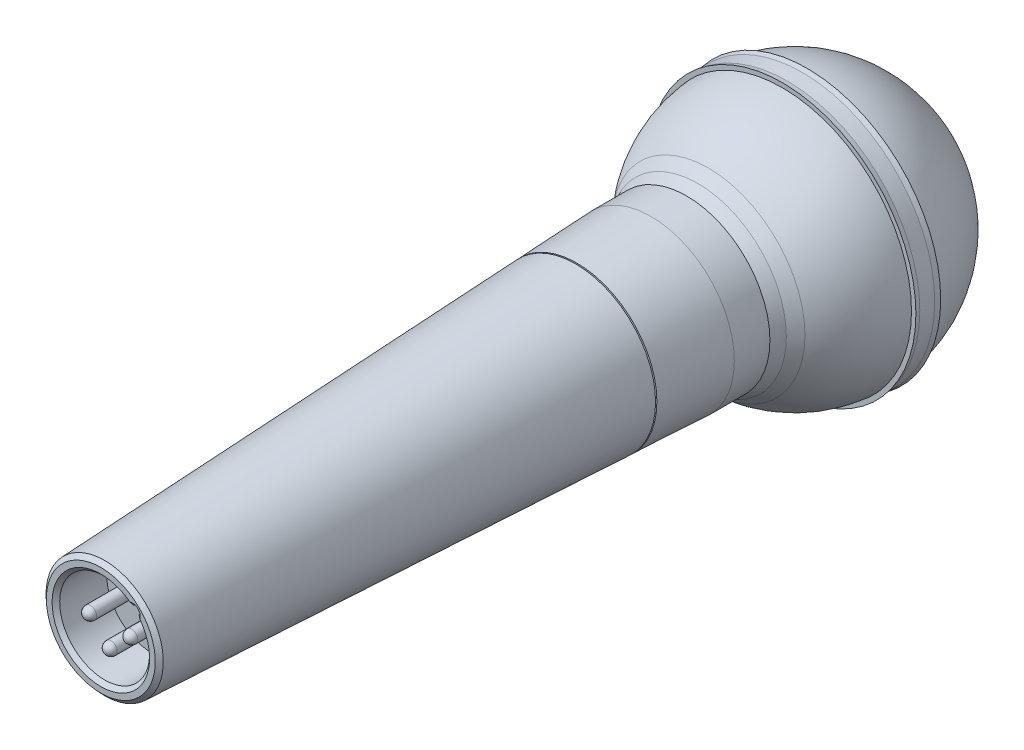
ISO-10303-21;
HEADER;
FILE_DESCRIPTION(('STEP AP214'),'2;1');
FILE_NAME('part.step','',(''),(''),'','','');
FILE_SCHEMA(('AUTOMOTIVE_DESIGN { 1 0 10303 214 1 1 1 1 }'));
ENDSEC;
DATA;
#1=APPLICATION_CONTEXT('core data for automotive mechanical design processes');
#2=APPLICATION_PROTOCOL_DEFINITION('international standard','automotive_design',2000,#1);
#3=PRODUCT_CONTEXT('',#1,'mechanical');
#4=PRODUCT('Part','Part','',(#3));
#5=PRODUCT_RELATED_PRODUCT_CATEGORY('part','',(#4));
#6=PRODUCT_DEFINITION_FORMATION('','',#4);
#7=PRODUCT_DEFINITION_CONTEXT('part definition',#1,'design');
#8=PRODUCT_DEFINITION('design','',#6,#7);
#9=PRODUCT_DEFINITION_SHAPE('','',#8);
#10=(LENGTH_UNIT() NAMED_UNIT(*) SI_UNIT(.MILLI.,.METRE.));
#11=(NAMED_UNIT(*) PLANE_ANGLE_UNIT() SI_UNIT($,.RADIAN.));
#12=(NAMED_UNIT(*) SI_UNIT($,.STERADIAN.) SOLID_ANGLE_UNIT());
#13=UNCERTAINTY_MEASURE_WITH_UNIT(LENGTH_MEASURE(1.E-05),#10,'distance_accuracy_value','');
#14=(GEOMETRIC_REPRESENTATION_CONTEXT(3) GLOBAL_UNCERTAINTY_ASSIGNED_CONTEXT((#13)) GLOBAL_UNIT_ASSIGNED_CONTEXT((#10,
#11,#12)) REPRESENTATION_CONTEXT('',''));
#15=CARTESIAN_POINT('',(0.,0.,0.));
#16=DIRECTION('',(0.,0.,1.));
#17=DIRECTION('',(1.,0.,0.));
#18=AXIS2_PLACEMENT_3D('',#15,#16,#17);
#19=CARTESIAN_POINT('',(0.,-4.0005,134.5));
#20=DIRECTION('',(0.,0.,-1.));
#21=DIRECTION('',(-1.,0.,0.));
#22=AXIS2_PLACEMENT_3D('',#19,#20,#21);
#23=CYLINDRICAL_SURFACE('',#22,1.2285);
#24=CARTESIAN_POINT('',(0.,-4.0005,134.5));
#25=DIRECTION('',(0.,0.,1.));
#26=DIRECTION('',(1.,0.,0.));
#27=AXIS2_PLACEMENT_3D('',#24,#25,#26);
#28=CIRCLE('',#27,1.2285);
#29=CARTESIAN_POINT('',(1.2285,-4.0005,134.5));
#30=VERTEX_POINT('',#29);
#31=EDGE_CURVE('E11',#30,#30,#28,.T.);
#32=ORIENTED_EDGE('',*,*,#31,.F.);
#33=EDGE_LOOP('',(#32));
#34=FACE_BOUND('',#33,.T.);
#35=CARTESIAN_POINT('',(0.,-4.0005,126.5));
#36=DIRECTION('',(0.,0.,1.));
#37=DIRECTION('',(1.,0.,0.));
#38=AXIS2_PLACEMENT_3D('',#35,#36,#37);
#39=CIRCLE('',#38,1.2285);
#40=CARTESIAN_POINT('',(1.2285,-4.0005,126.5));
#41=VERTEX_POINT('',#40);
#42=EDGE_CURVE('E50',#41,#41,#39,.T.);
#43=ORIENTED_EDGE('',*,*,#42,.T.);
#44=EDGE_LOOP('',(#43));
#45=FACE_BOUND('',#44,.T.);
#46=ADVANCED_FACE('F43',(#34,#45),#23,.T.);
#47=CARTESIAN_POINT('',(0.,-4.0005,134.5));
#48=DIRECTION('',(0.,0.,1.));
#49=DIRECTION('',(1.,0.,0.));
#50=AXIS2_PLACEMENT_3D('',#47,#48,#49);
#51=SPHERICAL_SURFACE('',#50,1.2285);
#52=ORIENTED_EDGE('',*,*,#31,.T.);
#53=EDGE_LOOP('',(#52));
#54=FACE_BOUND('',#53,.T.);
#55=ADVANCED_FACE('F45',(#54),#51,.T.);
#56=CARTESIAN_POINT('',(0.,-4.0005,126.5));
#57=DIRECTION('',(0.,0.,1.));
#58=DIRECTION('',(1.,0.,0.));
#59=AXIS2_PLACEMENT_3D('',#56,#57,#58);
#60=PLANE('',#59);
#61=ORIENTED_EDGE('',*,*,#42,.F.);
#62=EDGE_LOOP('',(#61));
#63=FACE_BOUND('',#62,.T.);
#64=ADVANCED_FACE('F57',(#63),#60,.F.);
#65=CLOSED_SHELL('',(#46,#55,#64));
#66=MANIFOLD_SOLID_BREP('B2',#65);
#67=CARTESIAN_POINT('',(4.05003,0.,134.5));
#68=DIRECTION('',(0.,0.,-1.));
#69=DIRECTION('',(-1.,0.,0.));
#70=AXIS2_PLACEMENT_3D('',#67,#68,#69);
#71=CYLINDRICAL_SURFACE('',#70,1.2285);
#72=CARTESIAN_POINT('',(4.05003,0.,134.5));
#73=DIRECTION('',(0.,0.,1.));
#74=DIRECTION('',(1.,0.,0.));
#75=AXIS2_PLACEMENT_3D('',#72,#73,#74);
#76=CIRCLE('',#75,1.2285);
#77=CARTESIAN_POINT('',(5.27853,0.,134.5));
#78=VERTEX_POINT('',#77);
#79=EDGE_CURVE('E42',#78,#78,#76,.T.);
#80=ORIENTED_EDGE('',*,*,#79,.F.);
#81=EDGE_LOOP('',(#80));
#82=FACE_BOUND('',#81,.T.);
#83=CARTESIAN_POINT('',(4.05003,0.,126.5));
#84=DIRECTION('',(0.,0.,1.));
#85=DIRECTION('',(1.,0.,0.));
#86=AXIS2_PLACEMENT_3D('',#83,#84,#85);
#87=CIRCLE('',#86,1.2285);
#88=CARTESIAN_POINT('',(5.27853,0.,126.5));
#89=VERTEX_POINT('',#88);
#90=EDGE_CURVE('E98',#89,#89,#87,.T.);
#91=ORIENTED_EDGE('',*,*,#90,.T.);
#92=EDGE_LOOP('',(#91));
#93=FACE_BOUND('',#92,.T.);
#94=ADVANCED_FACE('F91',(#82,#93),#71,.T.);
#95=CARTESIAN_POINT('',(4.05003,0.,134.5));
#96=DIRECTION('',(0.,0.,1.));
#97=DIRECTION('',(1.,0.,0.));
#98=AXIS2_PLACEMENT_3D('',#95,#96,#97);
#99=SPHERICAL_SURFACE('',#98,1.2285);
#100=ORIENTED_EDGE('',*,*,#79,.T.);
#101=EDGE_LOOP('',(#100));
#102=FACE_BOUND('',#101,.T.);
#103=ADVANCED_FACE('F93',(#102),#99,.T.);
#104=CARTESIAN_POINT('',(4.05003,0.,126.5));
#105=DIRECTION('',(0.,0.,1.));
#106=DIRECTION('',(1.,0.,0.));
#107=AXIS2_PLACEMENT_3D('',#104,#105,#106);
#108=PLANE('',#107);
#109=ORIENTED_EDGE('',*,*,#90,.F.);
#110=EDGE_LOOP('',(#109));
#111=FACE_BOUND('',#110,.T.);
#112=ADVANCED_FACE('F105',(#111),#108,.F.);
#113=CLOSED_SHELL('',(#94,#103,#112));
#114=MANIFOLD_SOLID_BREP('B6',#113);
#115=CARTESIAN_POINT('',(-4.05003,0.,134.5));
#116=DIRECTION('',(0.,0.,-1.));
#117=DIRECTION('',(-1.,0.,0.));
#118=AXIS2_PLACEMENT_3D('',#115,#116,#117);
#119=CYLINDRICAL_SURFACE('',#118,1.2285);
#120=CARTESIAN_POINT('',(-4.05003,0.,134.5));
#121=DIRECTION('',(0.,0.,1.));
#122=DIRECTION('',(1.,0.,0.));
#123=AXIS2_PLACEMENT_3D('',#120,#121,#122);
#124=CIRCLE('',#123,1.2285);
#125=CARTESIAN_POINT('',(-2.82153,0.,134.5));
#126=VERTEX_POINT('',#125);
#127=EDGE_CURVE('E90',#126,#126,#124,.T.);
#128=ORIENTED_EDGE('',*,*,#127,.F.);
#129=EDGE_LOOP('',(#128));
#130=FACE_BOUND('',#129,.T.);
#131=CARTESIAN_POINT('',(-4.05003,0.,126.5));
#132=DIRECTION('',(0.,0.,1.));
#133=DIRECTION('',(1.,0.,0.));
#134=AXIS2_PLACEMENT_3D('',#131,#132,#133);
#135=CIRCLE('',#134,1.2285);
#136=CARTESIAN_POINT('',(-2.82153,0.,126.5));
#137=VERTEX_POINT('',#136);
#138=EDGE_CURVE('E146',#137,#137,#135,.T.);
#139=ORIENTED_EDGE('',*,*,#138,.T.);
#140=EDGE_LOOP('',(#139));
#141=FACE_BOUND('',#140,.T.);
#142=ADVANCED_FACE('F139',(#130,#141),#119,.T.);
#143=CARTESIAN_POINT('',(-4.05003,0.,134.5));
#144=DIRECTION('',(0.,0.,1.));
#145=DIRECTION('',(1.,0.,0.));
#146=AXIS2_PLACEMENT_3D('',#143,#144,#145);
#147=SPHERICAL_SURFACE('',#146,1.2285);
#148=ORIENTED_EDGE('',*,*,#127,.T.);
#149=EDGE_LOOP('',(#148));
#150=FACE_BOUND('',#149,.T.);
#151=ADVANCED_FACE('F141',(#150),#147,.T.);
#152=CARTESIAN_POINT('',(-4.05003,0.,126.5));
#153=DIRECTION('',(0.,0.,1.));
#154=DIRECTION('',(1.,0.,0.));
#155=AXIS2_PLACEMENT_3D('',#152,#153,#154);
#156=PLANE('',#155);
#157=ORIENTED_EDGE('',*,*,#138,.F.);
#158=EDGE_LOOP('',(#157));
#159=FACE_BOUND('',#158,.T.);
#160=ADVANCED_FACE('F153',(#159),#156,.F.);
#161=CLOSED_SHELL('',(#142,#151,#160));
#162=MANIFOLD_SOLID_BREP('B37',#161);
#163=CARTESIAN_POINT('',(0.,0.,0.));
#164=DIRECTION('',(0.,0.,1.));
#165=DIRECTION('',(0.,1.,0.));
#166=AXIS2_PLACEMENT_3D('',#163,#164,#165);
#167=SPHERICAL_SURFACE('',#166,25.5);
#168=CARTESIAN_POINT('',(0.,0.,2.4259649046865));
#169=DIRECTION('',(0.,0.,1.));
#170=DIRECTION('',(1.,0.,0.));
#171=AXIS2_PLACEMENT_3D('',#168,#169,#170);
#172=CIRCLE('',#171,25.3843395478635);
#173=CARTESIAN_POINT('',(0.,25.3843395478635,2.4259649046865));
#174=VERTEX_POINT('',#173);
#175=EDGE_CURVE('E211',#174,#174,#172,.T.);
#176=CARTESIAN_POINT('',(0.,0.,-2.45102114535634));
#177=DIRECTION('',(0.,0.,1.));
#178=DIRECTION('',(1.,0.,0.));
#179=AXIS2_PLACEMENT_3D('',#176,#177,#178);
#180=CIRCLE('',#179,25.381932458838);
#181=CARTESIAN_POINT('',(0.,25.381932458838,-2.45102114535634));
#182=VERTEX_POINT('',#181);
#183=EDGE_CURVE('E138',#182,#182,#180,.T.);
#184=CARTESIAN_POINT('',(0.,25.3843395478635,2.4259649046865));
#185=CARTESIAN_POINT('',(0.,25.3891800339666,2.3753159886136));
#186=CARTESIAN_POINT('',(0.,25.393868927929,2.32465258499832));
#187=CARTESIAN_POINT('',(0.,25.4029433721403,2.22329861873268));
#188=CARTESIAN_POINT('',(0.,25.4073289223892,2.17260805608232));
#189=CARTESIAN_POINT('',(0.,25.4157965197412,2.07120158779621));
#190=CARTESIAN_POINT('',(0.,25.4198785668443,2.02048568216046));
#191=CARTESIAN_POINT('',(0.,25.4277390122595,1.91903034512205));
#192=CARTESIAN_POINT('',(0.,25.4315174105715,1.86829091371938));
#193=CARTESIAN_POINT('',(0.,25.4387704228587,1.76679034313868));
#194=CARTESIAN_POINT('',(0.,25.4422450368338,1.71602920396064));
#195=CARTESIAN_POINT('',(0.,25.4488903559951,1.61448703661726));
#196=CARTESIAN_POINT('',(0.,25.4520610611812,1.56370600845192));
#197=CARTESIAN_POINT('',(0.,25.4580984491455,1.46212588262959));
#198=CARTESIAN_POINT('',(0.,25.4609651319237,1.41132678497261));
#199=CARTESIAN_POINT('',(0.,25.4663943723612,1.30971234031146));
#200=CARTESIAN_POINT('',(0.,25.4689569300206,1.25889699330729));
#201=CARTESIAN_POINT('',(0.,25.4737778284026,1.15725187067807));
#202=CARTESIAN_POINT('',(0.,25.4760361691254,1.10642209505302));
#203=CARTESIAN_POINT('',(0.,25.4802485527174,1.00474993642543));
#204=CARTESIAN_POINT('',(0.,25.4822025955867,0.95390755342289));
#205=CARTESIAN_POINT('',(0.,25.4858063134581,0.8522120017354));
#206=CARTESIAN_POINT('',(0.,25.4874559884602,0.801358833050451));
#207=CARTESIAN_POINT('',(0.,25.4904509114888,0.699643532079691));
#208=CARTESIAN_POINT('',(0.,25.4917961595154,0.648781399793879));
#209=CARTESIAN_POINT('',(0.,25.4941821803925,0.547049994024107));
#210=CARTESIAN_POINT('',(0.,25.495222953243,0.496180720540146));
#211=CARTESIAN_POINT('',(0.,25.4969999864768,0.394436855032657));
#212=CARTESIAN_POINT('',(0.,25.49773624686,0.34356226300913));
#213=CARTESIAN_POINT('',(0.,25.498904228779,0.241809583271656));
#214=CARTESIAN_POINT('',(0.,25.4993359503146,0.19093149555771));
#215=CARTESIAN_POINT('',(0.,25.4998948390696,0.0891736474137984));
#216=CARTESIAN_POINT('',(0.,25.500022006289,0.0382938869838331));
#217=CARTESIAN_POINT('',(0.,25.499971781855,-0.0634654835577837));
#218=CARTESIAN_POINT('',(0.,25.4997943902016,-0.114345093669435));
#219=CARTESIAN_POINT('',(0.,25.4991350543781,-0.216102340545477));
#220=CARTESIAN_POINT('',(0.,25.498653110208,-0.266979977309867));
#221=CARTESIAN_POINT('',(0.,25.4973846866192,-0.368731454533145));
#222=CARTESIAN_POINT('',(0.,25.4965982072005,-0.419605294992032));
#223=CARTESIAN_POINT('',(0.,25.4947207412943,-0.521347356782085));
#224=CARTESIAN_POINT('',(0.,25.4936297548068,-0.57221557811325));
#225=CARTESIAN_POINT('',(0.,25.4911433138532,-0.673944579026974));
#226=CARTESIAN_POINT('',(0.,25.4897478593872,-0.724805358609533));
#227=CARTESIAN_POINT('',(0.,25.4866525324761,-0.826517653671799));
#228=CARTESIAN_POINT('',(0.,25.4849526600311,-0.877369169151507));
#229=CARTESIAN_POINT('',(0.,25.4812485580688,-0.97906111398576));
#230=CARTESIAN_POINT('',(0.,25.4792443285516,-1.02990154334031));
#231=CARTESIAN_POINT('',(0.,25.474931584257,-1.13156949429915));
#232=CARTESIAN_POINT('',(0.,25.4726230694797,-1.18239701590345));
#233=CARTESIAN_POINT('',(0.,25.4677018373794,-1.28403733019917));
#234=CARTESIAN_POINT('',(0.,25.4650891200564,-1.3348501228906));
#235=CARTESIAN_POINT('',(0.,25.4595595764798,-1.43645915872579));
#236=CARTESIAN_POINT('',(0.,25.4566427502263,-1.48725540186956));
#237=CARTESIAN_POINT('',(0.,25.4505050932962,-1.58882951856727));
#238=CARTESIAN_POINT('',(0.,25.4472842626196,-1.63960739212121));
#239=CARTESIAN_POINT('',(0.,25.4405387122583,-1.74114295025662));
#240=CARTESIAN_POINT('',(0.,25.4370139925736,-1.79190063483809));
#241=CARTESIAN_POINT('',(0.,25.4296607904435,-1.89339399636425));
#242=CARTESIAN_POINT('',(0.,25.4258323079981,-1.94412967330894));
#243=CARTESIAN_POINT('',(0.,25.417871717687,-2.04557720170467));
#244=CARTESIAN_POINT('',(0.,25.4137396098213,-2.09628905315571));
#245=CARTESIAN_POINT('',(0.,25.4051719161085,-2.19768711349032));
#246=CARTESIAN_POINT('',(0.,25.4007363302615,-2.24837332237389));
#247=CARTESIAN_POINT('',(0.,25.3915618418109,-2.34971828168214));
#248=CARTESIAN_POINT('',(0.,25.3868229392074,-2.40037703210682));
#249=CARTESIAN_POINT('',(0.,25.381932458838,-2.45102114535634));
#250=B_SPLINE_CURVE_WITH_KNOTS('',3,(#184,#185,#186,#187,#188,#189,#190,#191,#192,#193,#194,
#195,#196,#197,#198,#199,#200,#201,#202,#203,#204,#205,#206,#207,#208,#209,#210,#211,#212,#213,
#214,#215,#216,#217,#218,#219,#220,#221,#222,#223,#224,#225,#226,#227,#228,#229,#230,#231,#232,
#233,#234,#235,#236,#237,#238,#239,#240,#241,#242,#243,#244,#245,#246,#247,#248,#249),
.UNSPECIFIED.,.F.,.F.,(4,2,2,2,2,2,2,2,2,2,2,2,2,2,2,2,2,2,2,2,2,2,2,2,2,2,2,2,2,2,2,2,4),(0.,
0.15263884652556,0.30527769305112,0.457916539576678,0.610555386102239,0.763194232627798,
0.915833079153358,1.06847192567892,1.22111077220448,1.37374961873004,1.5263884652556,
1.67902731178116,1.83166615830672,1.98430500483228,2.13694385135784,2.2895826978834,
2.44222154440895,2.59486039093451,2.74749923746007,2.90013808398563,3.05277693051119,
3.20541577703675,3.35805462356231,3.51069347008787,3.66333231661343,3.81597116313899,
3.96861000966455,4.12124885619011,4.27388770271567,4.42652654924123,4.57916539576679,
4.73180424229235,4.88444308881791),.UNSPECIFIED.);
#251=EDGE_CURVE('BSEAM189',#174,#182,#250,.T.);
#252=ORIENTED_EDGE('',*,*,#175,.T.);
#253=ORIENTED_EDGE('',*,*,#183,.F.);
#254=ORIENTED_EDGE('',*,*,#251,.T.);
#255=ORIENTED_EDGE('',*,*,#251,.F.);
#256=EDGE_LOOP('',(#252,#254,#253,#255));
#257=FACE_BOUND('',#256,.T.);
#258=ADVANCED_FACE('F189',(#257),#167,.F.);
#259=CARTESIAN_POINT('',(0.,0.,-2.45102114535633));
#260=DIRECTION('',(0.,0.,-1.));
#261=DIRECTION('',(-1.,0.,0.));
#262=AXIS2_PLACEMENT_3D('',#259,#260,#261);
#263=PLANE('',#262);
#264=ORIENTED_EDGE('',*,*,#183,.T.);
#265=EDGE_LOOP('',(#264));
#266=FACE_BOUND('',#265,.T.);
#267=CARTESIAN_POINT('',(0.,0.,-2.45102114535634));
#268=DIRECTION('',(0.,0.,1.));
#269=DIRECTION('',(1.,0.,0.));
#270=AXIS2_PLACEMENT_3D('',#267,#268,#269);
#271=CIRCLE('',#270,26.2525954551123);
#272=CARTESIAN_POINT('',(26.2525954551123,0.,-2.45102114535634));
#273=VERTEX_POINT('',#272);
#274=EDGE_CURVE('E195',#273,#273,#271,.T.);
#275=ORIENTED_EDGE('',*,*,#274,.F.);
#276=EDGE_LOOP('',(#275));
#277=FACE_BOUND('',#276,.T.);
#278=ADVANCED_FACE('F237',(#266,#277),#263,.T.);
#279=CARTESIAN_POINT('',(0.,0.,-2.45102114535634));
#280=DIRECTION('',(0.,0.,-1.));
#281=DIRECTION('',(-1.,0.,0.));
#282=AXIS2_PLACEMENT_3D('',#279,#280,#281);
#283=CONICAL_SURFACE('',#282,26.2525954551123,0.210371316440974);
#284=CARTESIAN_POINT('',(0.,0.,-1.47927233093592));
#285=DIRECTION('',(0.,0.,1.));
#286=DIRECTION('',(1.,0.,0.));
#287=AXIS2_PLACEMENT_3D('',#284,#285,#286);
#288=CIRCLE('',#287,26.0450972890638);
#289=CARTESIAN_POINT('',(26.0450972890638,0.,-1.47927233093592));
#290=VERTEX_POINT('',#289);
#291=EDGE_CURVE('E199',#290,#290,#288,.T.);
#292=ORIENTED_EDGE('',*,*,#291,.F.);
#293=EDGE_LOOP('',(#292));
#294=FACE_BOUND('',#293,.T.);
#295=ORIENTED_EDGE('',*,*,#274,.T.);
#296=EDGE_LOOP('',(#295));
#297=FACE_BOUND('',#296,.T.);
#298=ADVANCED_FACE('F232',(#294,#297),#283,.T.);
#299=CARTESIAN_POINT('',(0.,0.,136.5));
#300=DIRECTION('',(0.,0.,1.));
#301=DIRECTION('',(1.,0.,0.));
#302=AXIS2_PLACEMENT_3D('',#299,#300,#301);
#303=CYLINDRICAL_SURFACE('',#302,26.0450972890638);
#304=CARTESIAN_POINT('',(0.,0.,1.45421609026603));
#305=DIRECTION('',(0.,0.,1.));
#306=DIRECTION('',(1.,0.,0.));
#307=AXIS2_PLACEMENT_3D('',#304,#305,#306);
#308=CIRCLE('',#307,26.0450972890638);
#309=CARTESIAN_POINT('',(26.0450972890638,0.,1.45421609026603));
#310=VERTEX_POINT('',#309);
#311=EDGE_CURVE('E203',#310,#310,#308,.T.);
#312=ORIENTED_EDGE('',*,*,#311,.F.);
#313=EDGE_LOOP('',(#312));
#314=FACE_BOUND('',#313,.T.);
#315=ORIENTED_EDGE('',*,*,#291,.T.);
#316=EDGE_LOOP('',(#315));
#317=FACE_BOUND('',#316,.T.);
#318=ADVANCED_FACE('F226',(#314,#317),#303,.T.);
#319=CARTESIAN_POINT('',(0.,0.,1.45421609026603));
#320=DIRECTION('',(0.,0.,1.));
#321=DIRECTION('',(1.,0.,0.));
#322=AXIS2_PLACEMENT_3D('',#319,#320,#321);
#323=CONICAL_SURFACE('',#322,26.0450972890638,0.210371316440976);
#324=CARTESIAN_POINT('',(0.,0.,2.4259649046865));
#325=DIRECTION('',(0.,0.,1.));
#326=DIRECTION('',(1.,0.,0.));
#327=AXIS2_PLACEMENT_3D('',#324,#325,#326);
#328=CIRCLE('',#327,26.2525954551123);
#329=CARTESIAN_POINT('',(26.2525954551123,0.,2.4259649046865));
#330=VERTEX_POINT('',#329);
#331=EDGE_CURVE('E208',#330,#330,#328,.T.);
#332=ORIENTED_EDGE('',*,*,#331,.F.);
#333=EDGE_LOOP('',(#332));
#334=FACE_BOUND('',#333,.T.);
#335=ORIENTED_EDGE('',*,*,#311,.T.);
#336=EDGE_LOOP('',(#335));
#337=FACE_BOUND('',#336,.T.);
#338=ADVANCED_FACE('F220',(#334,#337),#323,.T.);
#339=CARTESIAN_POINT('',(0.,0.,2.4259649046865));
#340=DIRECTION('',(0.,0.,-1.));
#341=DIRECTION('',(-1.,0.,0.));
#342=AXIS2_PLACEMENT_3D('',#339,#340,#341);
#343=PLANE('',#342);
#344=ORIENTED_EDGE('',*,*,#175,.F.);
#345=EDGE_LOOP('',(#344));
#346=FACE_BOUND('',#345,.T.);
#347=ORIENTED_EDGE('',*,*,#331,.T.);
#348=EDGE_LOOP('',(#347));
#349=FACE_BOUND('',#348,.T.);
#350=ADVANCED_FACE('F217',(#346,#349),#343,.F.);
#351=CLOSED_SHELL('',(#258,#278,#298,#318,#338,#350));
#352=MANIFOLD_SOLID_BREP('B85',#351);
#353=CARTESIAN_POINT('',(0.,0.,17.));
#354=DIRECTION('',(0.,0.,1.));
#355=DIRECTION('',(1.,0.,0.));
#356=AXIS2_PLACEMENT_3D('',#353,#354,#355);
#357=PLANE('',#356);
#358=CARTESIAN_POINT('',(0.,0.,17.));
#359=DIRECTION('',(0.,0.,1.));
#360=DIRECTION('',(1.,0.,0.));
#361=AXIS2_PLACEMENT_3D('',#358,#359,#360);
#362=CIRCLE('',#361,19.0065778087482);
#363=CARTESIAN_POINT('',(19.0065778087482,0.,17.));
#364=VERTEX_POINT('',#363);
#365=EDGE_CURVE('E369',#364,#364,#362,.T.);
#366=ORIENTED_EDGE('',*,*,#365,.F.);
#367=EDGE_LOOP('',(#366));
#368=FACE_BOUND('',#367,.T.);
#369=ADVANCED_FACE('F287',(#368),#357,.F.);
#370=CARTESIAN_POINT('',(0.,0.,17.));
#371=DIRECTION('',(0.,0.,-1.));
#372=DIRECTION('',(-1.,0.,0.));
#373=AXIS2_PLACEMENT_3D('',#370,#371,#372);
#374=CONICAL_SURFACE('',#373,19.0065778087482,0.664725483236005);
#375=CARTESIAN_POINT('',(0.,0.,19.0543708616064));
#376=DIRECTION('',(0.,0.,1.));
#377=DIRECTION('',(1.,0.,0.));
#378=AXIS2_PLACEMENT_3D('',#375,#376,#377);
#379=CIRCLE('',#378,17.3965577775945);
#380=CARTESIAN_POINT('',(17.3965577775945,0.,19.0543708616064));
#381=VERTEX_POINT('',#380);
#382=EDGE_CURVE('E366',#381,#381,#379,.T.);
#383=ORIENTED_EDGE('',*,*,#382,.F.);
#384=EDGE_LOOP('',(#383));
#385=FACE_BOUND('',#384,.T.);
#386=ORIENTED_EDGE('',*,*,#365,.T.);
#387=EDGE_LOOP('',(#386));
#388=FACE_BOUND('',#387,.T.);
#389=ADVANCED_FACE('F398',(#385,#388),#374,.T.);
#390=CARTESIAN_POINT('',(0.,0.,19.0543708616064));
#391=DIRECTION('',(0.,0.,-1.));
#392=DIRECTION('',(-1.,0.,0.));
#393=AXIS2_PLACEMENT_3D('',#390,#391,#392);
#394=CONICAL_SURFACE('',#393,17.3965577775945,0.426108166748607);
#395=CARTESIAN_POINT('',(0.,0.,21.2789364251652));
#396=DIRECTION('',(0.,0.,1.));
#397=DIRECTION('',(1.,0.,0.));
#398=AXIS2_PLACEMENT_3D('',#395,#396,#397);
#399=CIRCLE('',#398,16.3867852523651);
#400=CARTESIAN_POINT('',(16.3867852523651,0.,21.2789364251652));
#401=VERTEX_POINT('',#400);
#402=EDGE_CURVE('E363',#401,#401,#399,.T.);
#403=ORIENTED_EDGE('',*,*,#402,.F.);
#404=EDGE_LOOP('',(#403));
#405=FACE_BOUND('',#404,.T.);
#406=ORIENTED_EDGE('',*,*,#382,.T.);
#407=EDGE_LOOP('',(#406));
#408=FACE_BOUND('',#407,.T.);
#409=ADVANCED_FACE('F403',(#405,#408),#394,.T.);
#410=CARTESIAN_POINT('',(0.,0.,136.5));
#411=DIRECTION('',(0.,0.,1.));
#412=DIRECTION('',(1.,0.,0.));
#413=AXIS2_PLACEMENT_3D('',#410,#411,#412);
#414=CYLINDRICAL_SURFACE('',#413,16.3867852523651);
#415=CARTESIAN_POINT('',(0.,0.,28.2789364251652));
#416=DIRECTION('',(0.,0.,1.));
#417=DIRECTION('',(1.,0.,0.));
#418=AXIS2_PLACEMENT_3D('',#415,#416,#417);
#419=CIRCLE('',#418,16.3867852523651);
#420=CARTESIAN_POINT('',(16.3867852523651,0.,28.2789364251652));
#421=VERTEX_POINT('',#420);
#422=EDGE_CURVE('E360',#421,#421,#419,.T.);
#423=ORIENTED_EDGE('',*,*,#422,.F.);
#424=EDGE_LOOP('',(#423));
#425=FACE_BOUND('',#424,.T.);
#426=ORIENTED_EDGE('',*,*,#402,.T.);
#427=EDGE_LOOP('',(#426));
#428=FACE_BOUND('',#427,.T.);
#429=ADVANCED_FACE('F410',(#425,#428),#414,.T.);
#430=CARTESIAN_POINT('',(0.,0.,28.2789364251652));
#431=DIRECTION('',(0.,0.,-1.));
#432=DIRECTION('',(-1.,0.,0.));
#433=AXIS2_PLACEMENT_3D('',#430,#431,#432);
#434=CONICAL_SURFACE('',#433,16.3867852523651,0.0451249296586869);
#435=CARTESIAN_POINT('',(0.,0.,42.8513158901152));
#436=DIRECTION('',(0.,0.,1.));
#437=DIRECTION('',(1.,0.,0.));
#438=AXIS2_PLACEMENT_3D('',#435,#436,#437);
#439=CIRCLE('',#438,15.7287609573817);
#440=CARTESIAN_POINT('',(15.7287609573817,0.,42.8513158901152));
#441=VERTEX_POINT('',#440);
#442=EDGE_CURVE('E357',#441,#441,#439,.T.);
#443=ORIENTED_EDGE('',*,*,#442,.F.);
#444=EDGE_LOOP('',(#443));
#445=FACE_BOUND('',#444,.T.);
#446=ORIENTED_EDGE('',*,*,#422,.T.);
#447=EDGE_LOOP('',(#446));
#448=FACE_BOUND('',#447,.T.);
#449=ADVANCED_FACE('F414',(#445,#448),#434,.T.);
#450=CARTESIAN_POINT('',(0.,0.,42.8513158901152));
#451=DIRECTION('',(0.,0.,-1.));
#452=DIRECTION('',(-1.,0.,0.));
#453=AXIS2_PLACEMENT_3D('',#450,#451,#452);
#454=PLANE('',#453);
#455=CARTESIAN_POINT('',(0.,0.,42.8513158901152));
#456=DIRECTION('',(0.,0.,1.));
#457=DIRECTION('',(1.,0.,0.));
#458=AXIS2_PLACEMENT_3D('',#455,#456,#457);
#459=CIRCLE('',#458,15.2287609573817);
#460=CARTESIAN_POINT('',(15.2287609573817,0.,42.8513158901152));
#461=VERTEX_POINT('',#460);
#462=EDGE_CURVE('E354',#461,#461,#459,.T.);
#463=ORIENTED_EDGE('',*,*,#462,.F.);
#464=EDGE_LOOP('',(#463));
#465=FACE_BOUND('',#464,.T.);
#466=ORIENTED_EDGE('',*,*,#442,.T.);
#467=EDGE_LOOP('',(#466));
#468=FACE_BOUND('',#467,.T.);
#469=ADVANCED_FACE('F418',(#465,#468),#454,.F.);
#470=CARTESIAN_POINT('',(0.,0.,136.5));
#471=DIRECTION('',(0.,0.,1.));
#472=DIRECTION('',(1.,0.,0.));
#473=AXIS2_PLACEMENT_3D('',#470,#471,#472);
#474=CYLINDRICAL_SURFACE('',#473,15.2287609573817);
#475=CARTESIAN_POINT('',(0.,0.,43.1013158901152));
#476=DIRECTION('',(0.,0.,1.));
#477=DIRECTION('',(1.,0.,0.));
#478=AXIS2_PLACEMENT_3D('',#475,#476,#477);
#479=CIRCLE('',#478,15.2287609573817);
#480=CARTESIAN_POINT('',(15.2287609573817,0.,43.1013158901152));
#481=VERTEX_POINT('',#480);
#482=EDGE_CURVE('E348',#481,#481,#479,.T.);
#483=ORIENTED_EDGE('',*,*,#482,.F.);
#484=EDGE_LOOP('',(#483));
#485=FACE_BOUND('',#484,.T.);
#486=ORIENTED_EDGE('',*,*,#462,.T.);
#487=EDGE_LOOP('',(#486));
#488=FACE_BOUND('',#487,.T.);
#489=ADVANCED_FACE('F422',(#485,#488),#474,.T.);
#490=CARTESIAN_POINT('',(0.,0.,43.1013158901152));
#491=DIRECTION('',(0.,0.,1.));
#492=DIRECTION('',(1.,0.,0.));
#493=AXIS2_PLACEMENT_3D('',#490,#491,#492);
#494=PLANE('',#493);
#495=CARTESIAN_POINT('',(0.,0.,43.1013158901152));
#496=DIRECTION('',(0.,0.,1.));
#497=DIRECTION('',(1.,0.,0.));
#498=AXIS2_PLACEMENT_3D('',#495,#496,#497);
#499=CIRCLE('',#498,15.7174720615537);
#500=CARTESIAN_POINT('',(15.7174720615537,0.,43.1013158901152));
#501=VERTEX_POINT('',#500);
#502=EDGE_CURVE('E345',#501,#501,#499,.T.);
#503=ORIENTED_EDGE('',*,*,#502,.F.);
#504=EDGE_LOOP('',(#503));
#505=FACE_BOUND('',#504,.T.);
#506=ORIENTED_EDGE('',*,*,#482,.T.);
#507=EDGE_LOOP('',(#506));
#508=FACE_BOUND('',#507,.T.);
#509=ADVANCED_FACE('F426',(#505,#508),#494,.F.);
#510=CARTESIAN_POINT('',(0.,0.,43.1013158901152));
#511=DIRECTION('',(0.,0.,-1.));
#512=DIRECTION('',(-1.,0.,0.));
#513=AXIS2_PLACEMENT_3D('',#510,#511,#512);
#514=CONICAL_SURFACE('',#513,15.7174720615537,0.0451249296586864);
#515=CARTESIAN_POINT('',(0.,0.,135.750763467664));
#516=DIRECTION('',(0.,0.,1.));
#517=DIRECTION('',(1.,0.,0.));
#518=AXIS2_PLACEMENT_3D('',#515,#516,#517);
#519=CIRCLE('',#518,11.5338322126563);
#520=CARTESIAN_POINT('',(-11.5338322126563,0.,135.750763467664));
#521=VERTEX_POINT('',#520);
#522=EDGE_CURVE('E187',#521,#521,#519,.F.);
#523=ORIENTED_EDGE('',*,*,#522,.T.);
#524=EDGE_LOOP('',(#523));
#525=FACE_BOUND('',#524,.T.);
#526=ORIENTED_EDGE('',*,*,#502,.T.);
#527=EDGE_LOOP('',(#526));
#528=FACE_BOUND('',#527,.T.);
#529=ADVANCED_FACE('F430',(#525,#528),#514,.T.);
#530=CARTESIAN_POINT('',(0.,0.,136.5));
#531=DIRECTION('',(0.,0.,-1.));
#532=DIRECTION('',(-1.,0.,0.));
#533=AXIS2_PLACEMENT_3D('',#530,#531,#532);
#534=PLANE('',#533);
#535=CARTESIAN_POINT('',(0.,0.,136.5));
#536=DIRECTION('',(0.,0.,-1.));
#537=DIRECTION('',(-1.,0.,0.));
#538=AXIS2_PLACEMENT_3D('',#535,#536,#537);
#539=CIRCLE('',#538,9.58872238545082);
#540=CARTESIAN_POINT('',(7.6671024791717,5.75839704771431,136.5));
#541=VERTEX_POINT('',#540);
#542=CARTESIAN_POINT('',(5.75839704771439,7.66710247917164,136.5));
#543=VERTEX_POINT('',#542);
#544=EDGE_CURVE('E307',#541,#543,#539,.T.);
#545=ORIENTED_EDGE('',*,*,#544,.T.);
#546=CARTESIAN_POINT('',(6.24992053577763,6.24992053577757,136.5));
#547=DIRECTION('',(0.,0.,-1.));
#548=DIRECTION('',(-1.,0.,0.));
#549=AXIS2_PLACEMENT_3D('',#546,#547,#548);
#550=CIRCLE('',#549,1.50000000000002);
#551=EDGE_CURVE('E378',#543,#541,#550,.T.);
#552=ORIENTED_EDGE('',*,*,#551,.T.);
#553=EDGE_LOOP('',(#545,#552));
#554=FACE_BOUND('',#553,.T.);
#555=CARTESIAN_POINT('',(0.,0.,136.5));
#556=DIRECTION('',(0.,0.,-1.));
#557=DIRECTION('',(-1.,0.,0.));
#558=AXIS2_PLACEMENT_3D('',#555,#556,#557);
#559=CIRCLE('',#558,10.7137313341191);
#560=CARTESIAN_POINT('',(-10.7137313341191,0.,136.5));
#561=VERTEX_POINT('',#560);
#562=EDGE_CURVE('E374',#561,#561,#559,.F.);
#563=ORIENTED_EDGE('',*,*,#562,.T.);
#564=EDGE_LOOP('',(#563));
#565=FACE_BOUND('',#564,.T.);
#566=ADVANCED_FACE('F434',(#554,#565),#534,.F.);
#567=CARTESIAN_POINT('',(0.,0.,126.5));
#568=DIRECTION('',(0.,0.,1.));
#569=DIRECTION('',(1.,0.,0.));
#570=AXIS2_PLACEMENT_3D('',#567,#568,#569);
#571=CYLINDRICAL_SURFACE('',#570,8.8387223854508);
#572=DIRECTION('',(0.,0.,1.));
#573=VECTOR('',#572,1.);
#574=CARTESIAN_POINT('',(5.69756768801554,6.75727281138999,131.5));
#575=LINE('',#574,#573);
#576=CARTESIAN_POINT('',(5.69756768801553,6.75727281138999,126.5));
#577=VERTEX_POINT('',#576);
#578=CARTESIAN_POINT('',(5.69756768801554,6.75727281138999,135.75));
#579=VERTEX_POINT('',#578);
#580=EDGE_CURVE('E337',#577,#579,#575,.T.);
#581=ORIENTED_EDGE('',*,*,#580,.T.);
#582=CARTESIAN_POINT('',(0.,0.,135.75));
#583=DIRECTION('',(0.,0.,-1.));
#584=DIRECTION('',(-1.,0.,0.));
#585=AXIS2_PLACEMENT_3D('',#582,#583,#584);
#586=CIRCLE('',#585,8.8387223854508);
#587=CARTESIAN_POINT('',(6.75727281139005,5.69756768801547,135.75));
#588=VERTEX_POINT('',#587);
#589=EDGE_CURVE('E300',#579,#588,#586,.F.);
#590=ORIENTED_EDGE('',*,*,#589,.T.);
#591=DIRECTION('',(0.,0.,1.));
#592=VECTOR('',#591,1.);
#593=CARTESIAN_POINT('',(6.75727281139005,5.69756768801547,131.5));
#594=LINE('',#593,#592);
#595=CARTESIAN_POINT('',(6.75727281139005,5.69756768801547,126.5));
#596=VERTEX_POINT('',#595);
#597=EDGE_CURVE('E328',#588,#596,#594,.F.);
#598=ORIENTED_EDGE('',*,*,#597,.T.);
#599=CARTESIAN_POINT('',(0.,0.,126.5));
#600=DIRECTION('',(0.,0.,1.));
#601=DIRECTION('',(1.,0.,0.));
#602=AXIS2_PLACEMENT_3D('',#599,#600,#601);
#603=CIRCLE('',#602,8.8387223854508);
#604=EDGE_CURVE('E333',#577,#596,#603,.T.);
#605=ORIENTED_EDGE('',*,*,#604,.F.);
#606=EDGE_LOOP('',(#581,#590,#598,#605));
#607=FACE_BOUND('',#606,.T.);
#608=ADVANCED_FACE('F331',(#607),#571,.F.);
#609=CARTESIAN_POINT('',(0.,0.,126.5));
#610=DIRECTION('',(0.,0.,1.));
#611=DIRECTION('',(1.,0.,0.));
#612=AXIS2_PLACEMENT_3D('',#609,#610,#611);
#613=PLANE('',#612);
#614=ORIENTED_EDGE('',*,*,#604,.T.);
#615=CARTESIAN_POINT('',(6.24992053577763,6.24992053577757,126.5));
#616=DIRECTION('',(0.,0.,1.));
#617=DIRECTION('',(1.,0.,0.));
#618=AXIS2_PLACEMENT_3D('',#615,#616,#617);
#619=CIRCLE('',#618,0.749999999999999);
#620=EDGE_CURVE('E338',#577,#596,#619,.F.);
#621=ORIENTED_EDGE('',*,*,#620,.F.);
#622=EDGE_LOOP('',(#614,#621));
#623=FACE_BOUND('',#622,.T.);
#624=ADVANCED_FACE('F344',(#623),#613,.T.);
#625=CARTESIAN_POINT('',(6.24992053577763,6.24992053577757,124.37867965644));
#626=DIRECTION('',(0.,0.,1.));
#627=DIRECTION('',(1.,0.,0.));
#628=AXIS2_PLACEMENT_3D('',#625,#626,#627);
#629=CYLINDRICAL_SURFACE('',#628,0.749999999999999);
#630=ORIENTED_EDGE('',*,*,#597,.F.);
#631=CARTESIAN_POINT('',(6.24992053577763,6.24992053577757,135.75));
#632=DIRECTION('',(0.,0.,-1.));
#633=DIRECTION('',(-1.,0.,0.));
#634=AXIS2_PLACEMENT_3D('',#631,#632,#633);
#635=CIRCLE('',#634,0.749999999999999);
#636=EDGE_CURVE('E372',#588,#579,#635,.F.);
#637=ORIENTED_EDGE('',*,*,#636,.T.);
#638=ORIENTED_EDGE('',*,*,#580,.F.);
#639=ORIENTED_EDGE('',*,*,#620,.T.);
#640=EDGE_LOOP('',(#630,#637,#638,#639));
#641=FACE_BOUND('',#640,.T.);
#642=ADVANCED_FACE('F341',(#641),#629,.F.);
#643=CARTESIAN_POINT('',(0.,0.,135.75));
#644=DIRECTION('',(0.,0.,1.));
#645=DIRECTION('',(1.,0.,0.));
#646=AXIS2_PLACEMENT_3D('',#643,#644,#645);
#647=CONICAL_SURFACE('',#646,8.8387223854508,0.785398163397444);
#648=CARTESIAN_POINT('',(5.69756768801554,6.75727281138999,135.75));
#649=CARTESIAN_POINT('',(5.69566966912271,6.78714580042883,135.771615445747));
#650=CARTESIAN_POINT('',(5.69433884878488,6.81683258592586,135.793525275315));
#651=CARTESIAN_POINT('',(5.69265377509494,6.87585802323817,135.837830506629));
#652=CARTESIAN_POINT('',(5.69229925240116,6.90519676884652,135.860225772734));
#653=CARTESIAN_POINT('',(5.69246237796106,6.9926969957553,135.927960695647));
#654=CARTESIAN_POINT('',(5.69420374709337,7.05039851540514,135.973890486954));
#655=CARTESIAN_POINT('',(5.70010573651034,7.16462698041678,136.066711795212));
#656=CARTESIAN_POINT('',(5.70426002170698,7.22115660157792,136.113600484738));
#657=CARTESIAN_POINT('',(5.71443778485621,7.33338569265921,136.20818070094));
#658=CARTESIAN_POINT('',(5.72046165760023,7.38908498463695,136.255872395169));
#659=CARTESIAN_POINT('',(5.7317994229783,7.48182657533393,136.336291486576));
#660=CARTESIAN_POINT('',(5.73671000413601,7.51906128193074,136.368855924675));
#661=CARTESIAN_POINT('',(5.74712783665012,7.59327420636809,136.434247649181));
#662=CARTESIAN_POINT('',(5.75263560871648,7.63025216996901,136.467075141481));
#663=CARTESIAN_POINT('',(5.75839704771394,7.66710247917195,136.5));
#664=B_SPLINE_CURVE_WITH_KNOTS('',3,(#648,#649,#650,#651,#652,#653,#654,#655,#656,#657,#658,
#659,#660,#661,#662,#663),.UNSPECIFIED.,.F.,.F.,(4,2,2,2,2,2,2,4),(0.,0.110748356043661,
0.221466155691574,0.442693512391423,0.663342647581593,0.88403840788121,1.03316085034176,
1.18241437928227),.UNSPECIFIED.);
#665=EDGE_CURVE('E380',#543,#579,#664,.F.);
#666=ORIENTED_EDGE('',*,*,#665,.F.);
#667=ORIENTED_EDGE('',*,*,#544,.F.);
#668=CARTESIAN_POINT('',(7.6671024791717,5.75839704771431,136.5));
#669=CARTESIAN_POINT('',(7.63061163751259,5.75269051577132,136.467395316617));
#670=CARTESIAN_POINT('',(7.59399598984894,5.74723471042513,136.434887928489));
#671=CARTESIAN_POINT('',(7.52047549792398,5.7369031190304,136.370097862497));
#672=CARTESIAN_POINT('',(7.4835706109091,5.73202742052135,136.337815219237));
#673=CARTESIAN_POINT('',(7.37254629200127,5.71841134159325,136.241509208782));
#674=CARTESIAN_POINT('',(7.29795301773257,5.71065554547465,136.177880476847));
#675=CARTESIAN_POINT('',(7.1847945926546,5.70172352596225,136.083544741263));
#676=CARTESIAN_POINT('',(7.14682347665342,5.69919524446406,136.052252034808));
#677=CARTESIAN_POINT('',(7.07042972758471,5.69522956561354,135.990160642183));
#678=CARTESIAN_POINT('',(7.03200715974449,5.69379201259022,135.959361886129));
#679=CARTESIAN_POINT('',(6.95456065739054,5.69222773729796,135.898312556008));
#680=CARTESIAN_POINT('',(6.91553560098911,5.69210385978861,135.868063313152));
#681=CARTESIAN_POINT('',(6.83687515389338,5.69351011664293,135.808371247023));
#682=CARTESIAN_POINT('',(6.79723946594944,5.69504108336851,135.778928837214));
#683=CARTESIAN_POINT('',(6.75727281139005,5.69756768801547,135.75));
#684=B_SPLINE_CURVE_WITH_KNOTS('',3,(#668,#669,#670,#671,#672,#673,#674,#675,#676,#677,#678,
#679,#680,#681,#682,#683),.UNSPECIFIED.,.F.,.F.,(4,2,2,2,2,2,2,4),(0.,0.147796635687595,
0.295615546026505,0.59058714905414,0.738381218198769,0.886154189901139,1.03424709826078,
1.18241452981512),.UNSPECIFIED.);
#685=EDGE_CURVE('E291',#588,#541,#684,.F.);
#686=ORIENTED_EDGE('',*,*,#685,.F.);
#687=ORIENTED_EDGE('',*,*,#589,.F.);
#688=EDGE_LOOP('',(#666,#667,#686,#687));
#689=FACE_BOUND('',#688,.T.);
#690=ADVANCED_FACE('F384',(#689),#647,.F.);
#691=CARTESIAN_POINT('',(6.24992053577763,6.24992053577757,135.75));
#692=DIRECTION('',(0.,0.,1.));
#693=DIRECTION('',(1.,0.,0.));
#694=AXIS2_PLACEMENT_3D('',#691,#692,#693);
#695=CONICAL_SURFACE('',#694,0.749999999999999,0.785398163397443);
#696=ORIENTED_EDGE('',*,*,#685,.T.);
#697=ORIENTED_EDGE('',*,*,#551,.F.);
#698=ORIENTED_EDGE('',*,*,#665,.T.);
#699=ORIENTED_EDGE('',*,*,#636,.F.);
#700=EDGE_LOOP('',(#696,#697,#698,#699));
#701=FACE_BOUND('',#700,.T.);
#702=ADVANCED_FACE('F387',(#701),#695,.F.);
#703=CARTESIAN_POINT('',(0.,0.,136.5));
#704=DIRECTION('',(0.,0.,-1.));
#705=DIRECTION('',(-1.,0.,0.));
#706=AXIS2_PLACEMENT_3D('',#703,#704,#705);
#707=CONICAL_SURFACE('',#706,10.7137313341191,0.830523093056129);
#708=CARTESIAN_POINT('',(-11.5338322126563,0.,135.750763467664));
#709=CARTESIAN_POINT('',(-11.5252894951715,0.,135.758568014876));
#710=CARTESIAN_POINT('',(-11.5167467776868,0.,135.766372562088));
#711=CARTESIAN_POINT('',(-11.4996613427172,0.,135.781981656511));
#712=CARTESIAN_POINT('',(-11.4911186252325,0.,135.789786203723));
#713=CARTESIAN_POINT('',(-11.474033190263,0.,135.805395298147));
#714=CARTESIAN_POINT('',(-11.4654904727782,0.,135.813199845359));
#715=CARTESIAN_POINT('',(-11.4484050378087,0.,135.828808939782));
#716=CARTESIAN_POINT('',(-11.4398623203239,0.,135.836613486994));
#717=CARTESIAN_POINT('',(-11.4227768853544,0.,135.852222581418));
#718=CARTESIAN_POINT('',(-11.4142341678696,0.,135.86002712863));
#719=CARTESIAN_POINT('',(-11.3971487329001,0.,135.875636223053));
#720=CARTESIAN_POINT('',(-11.3886060154153,0.,135.883440770265));
#721=CARTESIAN_POINT('',(-11.3715205804458,0.,135.899049864689));
#722=CARTESIAN_POINT('',(-11.362977862961,0.,135.906854411901));
#723=CARTESIAN_POINT('',(-11.3458924279915,0.,135.922463506324));
#724=CARTESIAN_POINT('',(-11.3373497105068,0.,135.930268053536));
#725=CARTESIAN_POINT('',(-11.3202642755372,0.,135.94587714796));
#726=CARTESIAN_POINT('',(-11.3117215580525,0.,135.953681695172));
#727=CARTESIAN_POINT('',(-11.2946361230829,0.,135.969290789595));
#728=CARTESIAN_POINT('',(-11.2860934055982,0.,135.977095336807));
#729=CARTESIAN_POINT('',(-11.2690079706287,0.,135.992704431231));
#730=CARTESIAN_POINT('',(-11.2604652531439,0.,136.000508978443));
#731=CARTESIAN_POINT('',(-11.2433798181744,0.,136.016118072866));
#732=CARTESIAN_POINT('',(-11.2348371006896,0.,136.023922620078));
#733=CARTESIAN_POINT('',(-11.2177516657201,0.,136.039531714502));
#734=CARTESIAN_POINT('',(-11.2092089482353,0.,136.047336261714));
#735=CARTESIAN_POINT('',(-11.1921235132658,0.,136.062945356137));
#736=CARTESIAN_POINT('',(-11.183580795781,0.,136.070749903349));
#737=CARTESIAN_POINT('',(-11.1664953608115,0.,136.086358997773));
#738=CARTESIAN_POINT('',(-11.1579526433267,0.,136.094163544985));
#739=CARTESIAN_POINT('',(-11.1408672083572,0.,136.109772639408));
#740=CARTESIAN_POINT('',(-11.1323244908725,0.,136.11757718662));
#741=CARTESIAN_POINT('',(-11.1152390559029,0.,136.133186281044));
#742=CARTESIAN_POINT('',(-11.1066963384182,0.,136.140990828256));
#743=CARTESIAN_POINT('',(-11.0896109034486,0.,136.156599922679));
#744=CARTESIAN_POINT('',(-11.0810681859639,0.,136.164404469891));
#745=CARTESIAN_POINT('',(-11.0639827509944,0.,136.180013564315));
#746=CARTESIAN_POINT('',(-11.0554400335096,0.,136.187818111527));
#747=CARTESIAN_POINT('',(-11.0383545985401,0.,136.20342720595));
#748=CARTESIAN_POINT('',(-11.0298118810553,0.,136.211231753162));
#749=CARTESIAN_POINT('',(-11.0127264460858,0.,136.226840847586));
#750=CARTESIAN_POINT('',(-11.004183728601,0.,136.234645394798));
#751=CARTESIAN_POINT('',(-10.9870982936315,0.,136.250254489221));
#752=CARTESIAN_POINT('',(-10.9785555761467,0.,136.258059036433));
#753=CARTESIAN_POINT('',(-10.9614701411772,0.,136.273668130857));
#754=CARTESIAN_POINT('',(-10.9529274236924,0.,136.281472678069));
#755=CARTESIAN_POINT('',(-10.9358419887229,0.,136.297081772492));
#756=CARTESIAN_POINT('',(-10.9272992712382,0.,136.304886319704));
#757=CARTESIAN_POINT('',(-10.9102138362686,0.,136.320495414128));
#758=CARTESIAN_POINT('',(-10.9016711187839,0.,136.32829996134));
#759=CARTESIAN_POINT('',(-10.8845856838143,0.,136.343909055763));
#760=CARTESIAN_POINT('',(-10.8760429663296,0.,136.351713602975));
#761=CARTESIAN_POINT('',(-10.8589575313601,0.,136.367322697399));
#762=CARTESIAN_POINT('',(-10.8504148138753,0.,136.375127244611));
#763=CARTESIAN_POINT('',(-10.8333293789058,0.,136.390736339034));
#764=CARTESIAN_POINT('',(-10.824786661421,0.,136.398540886246));
#765=CARTESIAN_POINT('',(-10.8077012264515,0.,136.41414998067));
#766=CARTESIAN_POINT('',(-10.7991585089667,0.,136.421954527882));
#767=CARTESIAN_POINT('',(-10.7820730739972,0.,136.437563622305));
#768=CARTESIAN_POINT('',(-10.7735303565124,0.,136.445368169517));
#769=CARTESIAN_POINT('',(-10.7564449215429,0.,136.460977263941));
#770=CARTESIAN_POINT('',(-10.7479022040581,0.,136.468781811153));
#771=CARTESIAN_POINT('',(-10.7308167690886,0.,136.484390905576));
#772=CARTESIAN_POINT('',(-10.7222740516039,0.,136.492195452788));
#773=CARTESIAN_POINT('',(-10.7137313341191,0.,136.5));
#774=B_SPLINE_CURVE_WITH_KNOTS('',3,(#708,#709,#710,#711,#712,#713,#714,#715,#716,#717,#718,
#719,#720,#721,#722,#723,#724,#725,#726,#727,#728,#729,#730,#731,#732,#733,#734,#735,#736,#737,
#738,#739,#740,#741,#742,#743,#744,#745,#746,#747,#748,#749,#750,#751,#752,#753,#754,#755,#756,
#757,#758,#759,#760,#761,#762,#763,#764,#765,#766,#767,#768,#769,#770,#771,#772,#773),
.UNSPECIFIED.,.F.,.F.,(4,2,2,2,2,2,2,2,2,2,2,2,2,2,2,2,2,2,2,2,2,2,2,2,2,2,2,2,2,2,2,2,4),(0.,
0.0347131216236286,0.0694262432472399,0.10413936487085,0.138852486494461,0.173565608118071,
0.208278729741681,0.242991851365292,0.277704972988902,0.312418094612513,0.347131216236123,
0.381844337859752,0.416557459483363,0.451270581106973,0.485983702730584,0.520696824354194,
0.555409945977804,0.590123067601415,0.624836189225025,0.659549310848636,0.694262432472246,
0.728975554095856,0.763688675719486,0.798401797343096,0.833114918966707,0.867828040590317,
0.902541162213927,0.937254283837538,0.971967405461148,1.00668052708476,1.04139364870837,
1.07610677033198,1.11081989195559),.UNSPECIFIED.);
#775=EDGE_CURVE('BSEAM289',#521,#561,#774,.T.);
#776=ORIENTED_EDGE('',*,*,#522,.F.);
#777=ORIENTED_EDGE('',*,*,#562,.F.);
#778=ORIENTED_EDGE('',*,*,#775,.T.);
#779=ORIENTED_EDGE('',*,*,#775,.F.);
#780=EDGE_LOOP('',(#776,#778,#777,#779));
#781=FACE_BOUND('',#780,.T.);
#782=ADVANCED_FACE('F289',(#781),#707,.T.);
#783=CLOSED_SHELL('',(#369,#389,#409,#429,#449,#469,#489,#509,#529,#566,#608,#624,#642,#690,
#702,#782));
#784=MANIFOLD_SOLID_BREP('B133',#783);
#785=CARTESIAN_POINT('',(0.,0.,0.));
#786=DIRECTION('',(0.,0.,-1.));
#787=DIRECTION('',(1.,0.,0.));
#788=AXIS2_PLACEMENT_3D('',#785,#786,#787);
#789=SPHERICAL_SURFACE('',#788,25.5);
#790=CARTESIAN_POINT('',(0.,0.,17.));
#791=DIRECTION('',(0.,0.,-1.));
#792=DIRECTION('',(-1.,0.,0.));
#793=AXIS2_PLACEMENT_3D('',#790,#791,#792);
#794=CIRCLE('',#793,19.0065778087482);
#795=CARTESIAN_POINT('',(-19.0065778087482,0.,17.));
#796=VERTEX_POINT('',#795);
#797=EDGE_CURVE('E286',#796,#796,#794,.F.);
#798=ORIENTED_EDGE('',*,*,#797,.F.);
#799=EDGE_LOOP('',(#798));
#800=FACE_BOUND('',#799,.T.);
#801=ADVANCED_FACE('F579',(#800),#789,.T.);
#802=CARTESIAN_POINT('',(-25.5,19.0065778087482,17.));
#803=DIRECTION('',(0.,0.,-1.));
#804=DIRECTION('',(-1.,0.,0.));
#805=AXIS2_PLACEMENT_3D('',#802,#803,#804);
#806=PLANE('',#805);
#807=ORIENTED_EDGE('',*,*,#797,.T.);
#808=EDGE_LOOP('',(#807));
#809=FACE_BOUND('',#808,.T.);
#810=ADVANCED_FACE('F586',(#809),#806,.F.);
#811=CLOSED_SHELL('',(#801,#810));
#812=MANIFOLD_SOLID_BREP('B181',#811);
#813=ADVANCED_BREP_SHAPE_REPRESENTATION('',(#18,#66,#114,#162,#352,#784,#812),#14);
#814=SHAPE_DEFINITION_REPRESENTATION(#9,#813);
ENDSEC;
END-ISO-10303-21;
